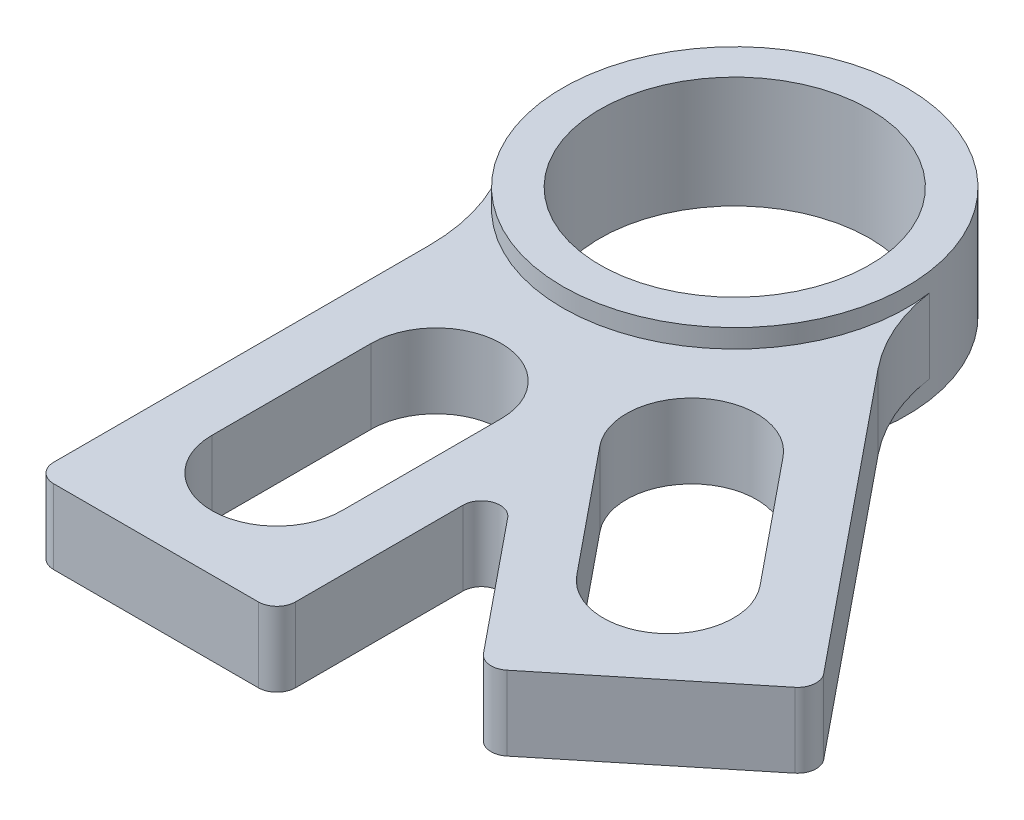
ISO-10303-21;
HEADER;
FILE_DESCRIPTION(('STEP AP214'),'2;1');
FILE_NAME('part.step','',(''),(''),'','','');
FILE_SCHEMA(('AUTOMOTIVE_DESIGN { 1 0 10303 214 1 1 1 1 }'));
ENDSEC;
DATA;
#1=APPLICATION_CONTEXT('core data for automotive mechanical design processes');
#2=APPLICATION_PROTOCOL_DEFINITION('international standard','automotive_design',2000,#1);
#3=PRODUCT_CONTEXT('',#1,'mechanical');
#4=PRODUCT('Part','Part','',(#3));
#5=PRODUCT_RELATED_PRODUCT_CATEGORY('part','',(#4));
#6=PRODUCT_DEFINITION_FORMATION('','',#4);
#7=PRODUCT_DEFINITION_CONTEXT('part definition',#1,'design');
#8=PRODUCT_DEFINITION('design','',#6,#7);
#9=PRODUCT_DEFINITION_SHAPE('','',#8);
#10=(LENGTH_UNIT() NAMED_UNIT(*) SI_UNIT(.MILLI.,.METRE.));
#11=(NAMED_UNIT(*) PLANE_ANGLE_UNIT() SI_UNIT($,.RADIAN.));
#12=(NAMED_UNIT(*) SI_UNIT($,.STERADIAN.) SOLID_ANGLE_UNIT());
#13=UNCERTAINTY_MEASURE_WITH_UNIT(LENGTH_MEASURE(1.E-05),#10,'distance_accuracy_value','');
#14=(GEOMETRIC_REPRESENTATION_CONTEXT(3) GLOBAL_UNCERTAINTY_ASSIGNED_CONTEXT((#13)) GLOBAL_UNIT_ASSIGNED_CONTEXT((#10,
#11,#12)) REPRESENTATION_CONTEXT('',''));
#15=CARTESIAN_POINT('',(0.,0.,0.));
#16=DIRECTION('',(0.,0.,1.));
#17=DIRECTION('',(1.,0.,0.));
#18=AXIS2_PLACEMENT_3D('',#15,#16,#17);
#19=CARTESIAN_POINT('',(0.,4.7625,0.));
#20=DIRECTION('',(0.,-1.,0.));
#21=DIRECTION('',(0.,0.,-1.));
#22=AXIS2_PLACEMENT_3D('',#19,#20,#21);
#23=CYLINDRICAL_SURFACE('',#22,11.5062);
#24=CARTESIAN_POINT('',(0.,4.7625,0.));
#25=DIRECTION('',(0.,1.,0.));
#26=DIRECTION('',(0.,0.,1.));
#27=AXIS2_PLACEMENT_3D('',#24,#25,#26);
#28=CIRCLE('',#27,11.5062);
#29=CARTESIAN_POINT('',(0.,4.7625,-11.5062));
#30=VERTEX_POINT('',#29);
#31=EDGE_CURVE('E301',#30,#30,#28,.T.);
#32=CARTESIAN_POINT('',(0.,-4.7625,0.));
#33=DIRECTION('',(0.,1.,0.));
#34=DIRECTION('',(0.,0.,1.));
#35=AXIS2_PLACEMENT_3D('',#32,#33,#34);
#36=CIRCLE('',#35,11.5062);
#37=CARTESIAN_POINT('',(0.,-4.7625,-11.5062));
#38=VERTEX_POINT('',#37);
#39=EDGE_CURVE('E296',#38,#38,#36,.T.);
#40=CARTESIAN_POINT('',(0.,4.7625,-11.5062));
#41=CARTESIAN_POINT('',(0.,4.66328125,-11.5062));
#42=CARTESIAN_POINT('',(0.,4.5640625,-11.5062));
#43=CARTESIAN_POINT('',(0.,4.365625,-11.5062));
#44=CARTESIAN_POINT('',(0.,4.26640625,-11.5062));
#45=CARTESIAN_POINT('',(0.,4.06796875,-11.5062));
#46=CARTESIAN_POINT('',(0.,3.96875,-11.5062));
#47=CARTESIAN_POINT('',(0.,3.7703125,-11.5062));
#48=CARTESIAN_POINT('',(0.,3.67109375,-11.5062));
#49=CARTESIAN_POINT('',(0.,3.47265625,-11.5062));
#50=CARTESIAN_POINT('',(0.,3.3734375,-11.5062));
#51=CARTESIAN_POINT('',(0.,3.175,-11.5062));
#52=CARTESIAN_POINT('',(0.,3.07578125,-11.5062));
#53=CARTESIAN_POINT('',(0.,2.87734375,-11.5062));
#54=CARTESIAN_POINT('',(0.,2.778125,-11.5062));
#55=CARTESIAN_POINT('',(0.,2.5796875,-11.5062));
#56=CARTESIAN_POINT('',(0.,2.48046875,-11.5062));
#57=CARTESIAN_POINT('',(0.,2.28203125,-11.5062));
#58=CARTESIAN_POINT('',(0.,2.1828125,-11.5062));
#59=CARTESIAN_POINT('',(0.,1.984375,-11.5062));
#60=CARTESIAN_POINT('',(0.,1.88515625,-11.5062));
#61=CARTESIAN_POINT('',(0.,1.68671875,-11.5062));
#62=CARTESIAN_POINT('',(0.,1.5875,-11.5062));
#63=CARTESIAN_POINT('',(0.,1.3890625,-11.5062));
#64=CARTESIAN_POINT('',(0.,1.28984375,-11.5062));
#65=CARTESIAN_POINT('',(0.,1.09140625,-11.5062));
#66=CARTESIAN_POINT('',(0.,0.992187499999999,-11.5062));
#67=CARTESIAN_POINT('',(0.,0.79375,-11.5062));
#68=CARTESIAN_POINT('',(0.,0.69453125,-11.5062));
#69=CARTESIAN_POINT('',(0.,0.49609375,-11.5062));
#70=CARTESIAN_POINT('',(0.,0.396875,-11.5062));
#71=CARTESIAN_POINT('',(0.,0.1984375,-11.5062));
#72=CARTESIAN_POINT('',(0.,0.0992187500000001,-11.5062));
#73=CARTESIAN_POINT('',(0.,-0.0992187500000001,-11.5062));
#74=CARTESIAN_POINT('',(0.,-0.1984375,-11.5062));
#75=CARTESIAN_POINT('',(0.,-0.396875,-11.5062));
#76=CARTESIAN_POINT('',(0.,-0.49609375,-11.5062));
#77=CARTESIAN_POINT('',(0.,-0.69453125,-11.5062));
#78=CARTESIAN_POINT('',(0.,-0.793750000000001,-11.5062));
#79=CARTESIAN_POINT('',(0.,-0.992187500000001,-11.5062));
#80=CARTESIAN_POINT('',(0.,-1.09140625,-11.5062));
#81=CARTESIAN_POINT('',(0.,-1.28984375,-11.5062));
#82=CARTESIAN_POINT('',(0.,-1.3890625,-11.5062));
#83=CARTESIAN_POINT('',(0.,-1.5875,-11.5062));
#84=CARTESIAN_POINT('',(0.,-1.68671875,-11.5062));
#85=CARTESIAN_POINT('',(0.,-1.88515625,-11.5062));
#86=CARTESIAN_POINT('',(0.,-1.984375,-11.5062));
#87=CARTESIAN_POINT('',(0.,-2.1828125,-11.5062));
#88=CARTESIAN_POINT('',(0.,-2.28203125,-11.5062));
#89=CARTESIAN_POINT('',(0.,-2.48046875,-11.5062));
#90=CARTESIAN_POINT('',(0.,-2.5796875,-11.5062));
#91=CARTESIAN_POINT('',(0.,-2.778125,-11.5062));
#92=CARTESIAN_POINT('',(0.,-2.87734375,-11.5062));
#93=CARTESIAN_POINT('',(0.,-3.07578125,-11.5062));
#94=CARTESIAN_POINT('',(0.,-3.175,-11.5062));
#95=CARTESIAN_POINT('',(0.,-3.3734375,-11.5062));
#96=CARTESIAN_POINT('',(0.,-3.47265625,-11.5062));
#97=CARTESIAN_POINT('',(0.,-3.67109375,-11.5062));
#98=CARTESIAN_POINT('',(0.,-3.7703125,-11.5062));
#99=CARTESIAN_POINT('',(0.,-3.96875,-11.5062));
#100=CARTESIAN_POINT('',(0.,-4.06796875,-11.5062));
#101=CARTESIAN_POINT('',(0.,-4.26640625,-11.5062));
#102=CARTESIAN_POINT('',(0.,-4.365625,-11.5062));
#103=CARTESIAN_POINT('',(0.,-4.5640625,-11.5062));
#104=CARTESIAN_POINT('',(0.,-4.66328125,-11.5062));
#105=CARTESIAN_POINT('',(0.,-4.7625,-11.5062));
#106=B_SPLINE_CURVE_WITH_KNOTS('',3,(#40,#41,#42,#43,#44,#45,#46,#47,#48,#49,#50,#51,#52,#53,
#54,#55,#56,#57,#58,#59,#60,#61,#62,#63,#64,#65,#66,#67,#68,#69,#70,#71,#72,#73,#74,#75,#76,#77,
#78,#79,#80,#81,#82,#83,#84,#85,#86,#87,#88,#89,#90,#91,#92,#93,#94,#95,#96,#97,#98,#99,#100,
#101,#102,#103,#104,#105),.UNSPECIFIED.,.F.,.F.,(4,2,2,2,2,2,2,2,2,2,2,2,2,2,2,2,2,2,2,2,2,2,2,
2,2,2,2,2,2,2,2,2,4),(0.,0.29765625,0.5953125,0.892968750000001,1.190625,1.48828125,1.7859375,
2.08359375,2.38125,2.67890625,2.9765625,3.27421875,3.571875,3.86953125,4.1671875,4.46484375,
4.7625,5.06015625,5.3578125,5.65546875,5.953125,6.25078125,6.5484375,6.84609375,7.14375,
7.44140625,7.7390625,8.03671875,8.334375,8.63203125,8.9296875,9.22734375,9.525),.UNSPECIFIED.);
#107=EDGE_CURVE('BSEAM43',#30,#38,#106,.T.);
#108=ORIENTED_EDGE('',*,*,#31,.T.);
#109=ORIENTED_EDGE('',*,*,#39,.F.);
#110=ORIENTED_EDGE('',*,*,#107,.T.);
#111=ORIENTED_EDGE('',*,*,#107,.F.);
#112=EDGE_LOOP('',(#108,#110,#109,#111));
#113=FACE_BOUND('',#112,.T.);
#114=ADVANCED_FACE('F43',(#113),#23,.F.);
#115=CARTESIAN_POINT('',(0.,4.7625,0.));
#116=DIRECTION('',(0.,-1.,0.));
#117=DIRECTION('',(0.,0.,-1.));
#118=AXIS2_PLACEMENT_3D('',#115,#116,#117);
#119=CYLINDRICAL_SURFACE('',#118,14.6812);
#120=DIRECTION('',(0.,-1.,0.));
#121=VECTOR('',#120,1.);
#122=CARTESIAN_POINT('',(14.5314286076469,4.7625,-2.09170171412202));
#123=LINE('',#122,#121);
#124=CARTESIAN_POINT('',(14.5314286076469,3.175,-2.09170171412202));
#125=VERTEX_POINT('',#124);
#126=CARTESIAN_POINT('',(14.5314286076469,-3.175,-2.09170171412202));
#127=VERTEX_POINT('',#126);
#128=EDGE_CURVE('E315',#125,#127,#123,.T.);
#129=ORIENTED_EDGE('',*,*,#128,.T.);
#130=CARTESIAN_POINT('',(0.,-3.175,0.));
#131=DIRECTION('',(0.,1.,0.));
#132=DIRECTION('',(0.,0.,1.));
#133=AXIS2_PLACEMENT_3D('',#130,#131,#132);
#134=CIRCLE('',#133,14.6812);
#135=CARTESIAN_POINT('',(-12.5938687913907,-3.175,7.54533646070437));
#136=VERTEX_POINT('',#135);
#137=EDGE_CURVE('E272',#136,#127,#134,.T.);
#138=ORIENTED_EDGE('',*,*,#137,.F.);
#139=DIRECTION('',(0.,-1.,0.));
#140=VECTOR('',#139,1.);
#141=CARTESIAN_POINT('',(-12.5938687913907,4.7625,7.54533646070436));
#142=LINE('',#141,#140);
#143=CARTESIAN_POINT('',(-12.5938687913907,3.175,7.54533646070437));
#144=VERTEX_POINT('',#143);
#145=EDGE_CURVE('E308',#136,#144,#142,.F.);
#146=ORIENTED_EDGE('',*,*,#145,.T.);
#147=CARTESIAN_POINT('',(0.,3.175,0.));
#148=DIRECTION('',(0.,1.,0.));
#149=DIRECTION('',(0.,0.,1.));
#150=AXIS2_PLACEMENT_3D('',#147,#148,#149);
#151=CIRCLE('',#150,14.6812);
#152=EDGE_CURVE('E234',#144,#125,#151,.T.);
#153=ORIENTED_EDGE('',*,*,#152,.T.);
#154=EDGE_LOOP('',(#129,#138,#146,#153));
#155=FACE_BOUND('',#154,.T.);
#156=CARTESIAN_POINT('',(0.,4.7625,0.));
#157=DIRECTION('',(0.,1.,0.));
#158=DIRECTION('',(0.,0.,1.));
#159=AXIS2_PLACEMENT_3D('',#156,#157,#158);
#160=CIRCLE('',#159,14.6812);
#161=CARTESIAN_POINT('',(0.,4.7625,14.6812));
#162=VERTEX_POINT('',#161);
#163=EDGE_CURVE('E304',#162,#162,#160,.T.);
#164=ORIENTED_EDGE('',*,*,#163,.F.);
#165=EDGE_LOOP('',(#164));
#166=FACE_BOUND('',#165,.T.);
#167=CARTESIAN_POINT('',(0.,-4.7625,0.));
#168=DIRECTION('',(0.,1.,0.));
#169=DIRECTION('',(0.,0.,1.));
#170=AXIS2_PLACEMENT_3D('',#167,#168,#169);
#171=CIRCLE('',#170,14.6812);
#172=CARTESIAN_POINT('',(0.,-4.7625,14.6812));
#173=VERTEX_POINT('',#172);
#174=EDGE_CURVE('E305',#173,#173,#171,.T.);
#175=ORIENTED_EDGE('',*,*,#174,.T.);
#176=EDGE_LOOP('',(#175));
#177=FACE_BOUND('',#176,.T.);
#178=ADVANCED_FACE('F411',(#155,#166,#177),#119,.T.);
#179=CARTESIAN_POINT('',(0.,4.7625,0.));
#180=DIRECTION('',(0.,1.,0.));
#181=DIRECTION('',(0.,0.,1.));
#182=AXIS2_PLACEMENT_3D('',#179,#180,#181);
#183=PLANE('',#182);
#184=ORIENTED_EDGE('',*,*,#31,.F.);
#185=EDGE_LOOP('',(#184));
#186=FACE_BOUND('',#185,.T.);
#187=ORIENTED_EDGE('',*,*,#163,.T.);
#188=EDGE_LOOP('',(#187));
#189=FACE_BOUND('',#188,.T.);
#190=ADVANCED_FACE('F447',(#186,#189),#183,.T.);
#191=CARTESIAN_POINT('',(0.,-4.7625,0.));
#192=DIRECTION('',(0.,1.,0.));
#193=DIRECTION('',(0.,0.,1.));
#194=AXIS2_PLACEMENT_3D('',#191,#192,#193);
#195=PLANE('',#194);
#196=ORIENTED_EDGE('',*,*,#39,.T.);
#197=EDGE_LOOP('',(#196));
#198=FACE_BOUND('',#197,.T.);
#199=ORIENTED_EDGE('',*,*,#174,.F.);
#200=EDGE_LOOP('',(#199));
#201=FACE_BOUND('',#200,.T.);
#202=ADVANCED_FACE('F621',(#198,#201),#195,.F.);
#203=CARTESIAN_POINT('',(-10.31875,3.175,0.));
#204=DIRECTION('',(-1.,0.,0.));
#205=DIRECTION('',(0.,0.,1.));
#206=AXIS2_PLACEMENT_3D('',#203,#204,#205);
#207=PLANE('',#206);
#208=DIRECTION('',(0.,0.,-1.));
#209=VECTOR('',#208,1.);
#210=CARTESIAN_POINT('',(-10.31875,-3.175,0.));
#211=LINE('',#210,#209);
#212=CARTESIAN_POINT('',(-10.31875,-3.175,47.8028));
#213=VERTEX_POINT('',#212);
#214=CARTESIAN_POINT('',(-10.31875,-3.175,15.7694921185655));
#215=VERTEX_POINT('',#214);
#216=EDGE_CURVE('E274',#213,#215,#211,.T.);
#217=ORIENTED_EDGE('',*,*,#216,.F.);
#218=DIRECTION('',(0.,-1.,0.));
#219=VECTOR('',#218,1.);
#220=CARTESIAN_POINT('',(-10.31875,3.175,47.8028));
#221=LINE('',#220,#219);
#222=CARTESIAN_POINT('',(-10.31875,3.175,47.8028));
#223=VERTEX_POINT('',#222);
#224=EDGE_CURVE('E374',#213,#223,#221,.F.);
#225=ORIENTED_EDGE('',*,*,#224,.T.);
#226=DIRECTION('',(0.,0.,-1.));
#227=VECTOR('',#226,1.);
#228=CARTESIAN_POINT('',(-10.31875,3.175,0.));
#229=LINE('',#228,#227);
#230=CARTESIAN_POINT('',(-10.31875,3.175,15.7694921185655));
#231=VERTEX_POINT('',#230);
#232=EDGE_CURVE('E236',#223,#231,#229,.T.);
#233=ORIENTED_EDGE('',*,*,#232,.T.);
#234=DIRECTION('',(0.,-1.,0.));
#235=VECTOR('',#234,1.);
#236=CARTESIAN_POINT('',(-10.31875,3.175,15.7694921185655));
#237=LINE('',#236,#235);
#238=EDGE_CURVE('E321',#231,#215,#237,.T.);
#239=ORIENTED_EDGE('',*,*,#238,.T.);
#240=EDGE_LOOP('',(#217,#225,#233,#239));
#241=FACE_BOUND('',#240,.T.);
#242=ADVANCED_FACE('F613',(#241),#207,.T.);
#243=CARTESIAN_POINT('',(0.,3.175,49.3903));
#244=DIRECTION('',(0.,0.,-1.));
#245=DIRECTION('',(-1.,0.,0.));
#246=AXIS2_PLACEMENT_3D('',#243,#244,#245);
#247=PLANE('',#246);
#248=DIRECTION('',(1.,0.,0.));
#249=VECTOR('',#248,1.);
#250=CARTESIAN_POINT('',(0.,-3.175,49.3903));
#251=LINE('',#250,#249);
#252=CARTESIAN_POINT('',(-8.73124999999999,-3.175,49.3903));
#253=VERTEX_POINT('',#252);
#254=CARTESIAN_POINT('',(8.73125,-3.175,49.3903));
#255=VERTEX_POINT('',#254);
#256=EDGE_CURVE('E276',#253,#255,#251,.T.);
#257=ORIENTED_EDGE('',*,*,#256,.T.);
#258=DIRECTION('',(0.,-1.,0.));
#259=VECTOR('',#258,1.);
#260=CARTESIAN_POINT('',(8.73125,3.175,49.3903));
#261=LINE('',#260,#259);
#262=CARTESIAN_POINT('',(8.73125,3.175,49.3903));
#263=VERTEX_POINT('',#262);
#264=EDGE_CURVE('E372',#255,#263,#261,.F.);
#265=ORIENTED_EDGE('',*,*,#264,.T.);
#266=DIRECTION('',(1.,0.,0.));
#267=VECTOR('',#266,1.);
#268=CARTESIAN_POINT('',(0.,3.175,49.3903));
#269=LINE('',#268,#267);
#270=CARTESIAN_POINT('',(-8.73124999999999,3.175,49.3903));
#271=VERTEX_POINT('',#270);
#272=EDGE_CURVE('E238',#271,#263,#269,.T.);
#273=ORIENTED_EDGE('',*,*,#272,.F.);
#274=DIRECTION('',(0.,-1.,0.));
#275=VECTOR('',#274,1.);
#276=CARTESIAN_POINT('',(-8.73124999999999,-3.175,49.3903));
#277=LINE('',#276,#275);
#278=EDGE_CURVE('E369',#271,#253,#277,.T.);
#279=ORIENTED_EDGE('',*,*,#278,.T.);
#280=EDGE_LOOP('',(#257,#265,#273,#279));
#281=FACE_BOUND('',#280,.T.);
#282=ADVANCED_FACE('F428',(#281),#247,.F.);
#283=CARTESIAN_POINT('',(10.31875,3.175,0.));
#284=DIRECTION('',(-1.,0.,0.));
#285=DIRECTION('',(0.,0.,1.));
#286=AXIS2_PLACEMENT_3D('',#283,#284,#285);
#287=PLANE('',#286);
#288=DIRECTION('',(0.,0.,-1.));
#289=VECTOR('',#288,1.);
#290=CARTESIAN_POINT('',(10.31875,-3.175,0.));
#291=LINE('',#290,#289);
#292=CARTESIAN_POINT('',(10.31875,-3.175,47.8028));
#293=VERTEX_POINT('',#292);
#294=CARTESIAN_POINT('',(10.31875,-3.175,33.5124305101251));
#295=VERTEX_POINT('',#294);
#296=EDGE_CURVE('E279',#293,#295,#291,.T.);
#297=ORIENTED_EDGE('',*,*,#296,.T.);
#298=DIRECTION('',(0.,-1.,0.));
#299=VECTOR('',#298,1.);
#300=CARTESIAN_POINT('',(10.31875,3.175,33.5124305101251));
#301=LINE('',#300,#299);
#302=CARTESIAN_POINT('',(10.31875,3.175,33.5124305101251));
#303=VERTEX_POINT('',#302);
#304=EDGE_CURVE('E367',#295,#303,#301,.F.);
#305=ORIENTED_EDGE('',*,*,#304,.T.);
#306=DIRECTION('',(0.,0.,-1.));
#307=VECTOR('',#306,1.);
#308=CARTESIAN_POINT('',(10.31875,3.175,0.));
#309=LINE('',#308,#307);
#310=CARTESIAN_POINT('',(10.31875,3.175,47.8028));
#311=VERTEX_POINT('',#310);
#312=EDGE_CURVE('E241',#311,#303,#309,.T.);
#313=ORIENTED_EDGE('',*,*,#312,.F.);
#314=DIRECTION('',(0.,-1.,0.));
#315=VECTOR('',#314,1.);
#316=CARTESIAN_POINT('',(10.31875,3.175,47.8028));
#317=LINE('',#316,#315);
#318=EDGE_CURVE('E364',#311,#293,#317,.T.);
#319=ORIENTED_EDGE('',*,*,#318,.T.);
#320=EDGE_LOOP('',(#297,#305,#313,#319));
#321=FACE_BOUND('',#320,.T.);
#322=ADVANCED_FACE('F383',(#321),#287,.F.);
#323=CARTESIAN_POINT('',(-8.00577533582321,3.175,6.510312038207));
#324=DIRECTION('',(-0.775847397778149,0.,0.630920609396201));
#325=DIRECTION('',(0.630920609396201,0.,0.775847397778149));
#326=AXIS2_PLACEMENT_3D('',#323,#324,#325);
#327=PLANE('',#326);
#328=DIRECTION('',(-0.630920609396201,0.,-0.775847397778149));
#329=VECTOR('',#328,1.);
#330=CARTESIAN_POINT('',(-8.00577533582321,-3.175,6.510312038207));
#331=LINE('',#330,#329);
#332=CARTESIAN_POINT('',(22.1539963710215,-3.175,43.5979900247163));
#333=VERTEX_POINT('',#332);
#334=CARTESIAN_POINT('',(13.1379077439728,-3.175,32.5108440427087));
#335=VERTEX_POINT('',#334);
#336=EDGE_CURVE('E282',#333,#335,#331,.T.);
#337=ORIENTED_EDGE('',*,*,#336,.F.);
#338=DIRECTION('',(0.,-1.,0.));
#339=VECTOR('',#338,1.);
#340=CARTESIAN_POINT('',(22.1539963710215,3.175,43.5979900247163));
#341=LINE('',#340,#339);
#342=CARTESIAN_POINT('',(22.1539963710215,3.175,43.5979900247163));
#343=VERTEX_POINT('',#342);
#344=EDGE_CURVE('E63',#333,#343,#341,.F.);
#345=ORIENTED_EDGE('',*,*,#344,.T.);
#346=DIRECTION('',(-0.630920609396201,0.,-0.775847397778149));
#347=VECTOR('',#346,1.);
#348=CARTESIAN_POINT('',(-8.00577533582321,3.175,6.510312038207));
#349=LINE('',#348,#347);
#350=CARTESIAN_POINT('',(13.1379077439728,3.175,32.5108440427087));
#351=VERTEX_POINT('',#350);
#352=EDGE_CURVE('E243',#343,#351,#349,.T.);
#353=ORIENTED_EDGE('',*,*,#352,.T.);
#354=DIRECTION('',(0.,-1.,0.));
#355=VECTOR('',#354,1.);
#356=CARTESIAN_POINT('',(13.1379077439728,3.175,32.5108440427087));
#357=LINE('',#356,#355);
#358=EDGE_CURVE('E360',#351,#335,#357,.T.);
#359=ORIENTED_EDGE('',*,*,#358,.T.);
#360=EDGE_LOOP('',(#337,#345,#353,#359));
#361=FACE_BOUND('',#360,.T.);
#362=ADVANCED_FACE('F387',(#361),#327,.T.);
#363=CARTESIAN_POINT('',(31.1613581742612,3.175,38.3193357304821));
#364=DIRECTION('',(-0.630920609396202,0.,-0.775847397778149));
#365=DIRECTION('',(-0.775847397778149,0.,0.630920609396202));
#366=AXIS2_PLACEMENT_3D('',#363,#364,#365);
#367=PLANE('',#366);
#368=DIRECTION('',(0.775847397778149,0.,-0.630920609396202));
#369=VECTOR('',#368,1.);
#370=CARTESIAN_POINT('',(31.1613581742612,-3.175,38.3193357304821));
#371=LINE('',#370,#369);
#372=CARTESIAN_POINT('',(24.3872405824108,-3.175,43.8280613012726));
#373=VERTEX_POINT('',#372);
#374=CARTESIAN_POINT('',(37.9354757661117,-3.175,32.8106101596915));
#375=VERTEX_POINT('',#374);
#376=EDGE_CURVE('E285',#373,#375,#371,.T.);
#377=ORIENTED_EDGE('',*,*,#376,.T.);
#378=DIRECTION('',(0.,-1.,0.));
#379=VECTOR('',#378,1.);
#380=CARTESIAN_POINT('',(37.9354757661117,3.175,32.8106101596915));
#381=LINE('',#380,#379);
#382=CARTESIAN_POINT('',(37.9354757661117,3.175,32.8106101596915));
#383=VERTEX_POINT('',#382);
#384=EDGE_CURVE('E350',#375,#383,#381,.F.);
#385=ORIENTED_EDGE('',*,*,#384,.T.);
#386=DIRECTION('',(0.775847397778149,0.,-0.630920609396202));
#387=VECTOR('',#386,1.);
#388=CARTESIAN_POINT('',(31.1613581742612,3.175,38.3193357304821));
#389=LINE('',#388,#387);
#390=CARTESIAN_POINT('',(24.3872405824108,3.175,43.8280613012726));
#391=VERTEX_POINT('',#390);
#392=EDGE_CURVE('E245',#391,#383,#389,.T.);
#393=ORIENTED_EDGE('',*,*,#392,.F.);
#394=DIRECTION('',(0.,-1.,0.));
#395=VECTOR('',#394,1.);
#396=CARTESIAN_POINT('',(24.3872405824108,-3.175,43.8280613012726));
#397=LINE('',#396,#395);
#398=EDGE_CURVE('E347',#391,#373,#397,.T.);
#399=ORIENTED_EDGE('',*,*,#398,.T.);
#400=EDGE_LOOP('',(#377,#385,#393,#399));
#401=FACE_BOUND('',#400,.T.);
#402=ADVANCED_FACE('F395',(#401),#367,.F.);
#403=CARTESIAN_POINT('',(0.,3.175,25.48255));
#404=DIRECTION('',(0.,-1.,0.));
#405=DIRECTION('',(0.,0.,-1.));
#406=AXIS2_PLACEMENT_3D('',#403,#404,#405);
#407=CYLINDRICAL_SURFACE('',#406,5.55625);
#408=CARTESIAN_POINT('',(0.,-3.175,25.48255));
#409=DIRECTION('',(0.,1.,0.));
#410=DIRECTION('',(0.,0.,1.));
#411=AXIS2_PLACEMENT_3D('',#408,#409,#410);
#412=CIRCLE('',#411,5.55625);
#413=CARTESIAN_POINT('',(5.55625,-3.175,25.48255));
#414=VERTEX_POINT('',#413);
#415=CARTESIAN_POINT('',(-5.55624999999999,-3.175,25.48255));
#416=VERTEX_POINT('',#415);
#417=EDGE_CURVE('E260',#414,#416,#412,.T.);
#418=ORIENTED_EDGE('',*,*,#417,.F.);
#419=DIRECTION('',(0.,-1.,0.));
#420=VECTOR('',#419,1.);
#421=CARTESIAN_POINT('',(5.55625,3.175,25.48255));
#422=LINE('',#421,#420);
#423=CARTESIAN_POINT('',(5.55625,3.175,25.48255));
#424=VERTEX_POINT('',#423);
#425=EDGE_CURVE('E294',#424,#414,#422,.T.);
#426=ORIENTED_EDGE('',*,*,#425,.F.);
#427=CARTESIAN_POINT('',(0.,3.175,25.48255));
#428=DIRECTION('',(0.,1.,0.));
#429=DIRECTION('',(0.,0.,1.));
#430=AXIS2_PLACEMENT_3D('',#427,#428,#429);
#431=CIRCLE('',#430,5.55625);
#432=CARTESIAN_POINT('',(-5.55624999999999,3.175,25.48255));
#433=VERTEX_POINT('',#432);
#434=EDGE_CURVE('E223',#424,#433,#431,.T.);
#435=ORIENTED_EDGE('',*,*,#434,.T.);
#436=DIRECTION('',(0.,-1.,0.));
#437=VECTOR('',#436,1.);
#438=CARTESIAN_POINT('',(-5.55624999999999,3.175,25.48255));
#439=LINE('',#438,#437);
#440=EDGE_CURVE('E202',#433,#416,#439,.T.);
#441=ORIENTED_EDGE('',*,*,#440,.T.);
#442=EDGE_LOOP('',(#418,#426,#435,#441));
#443=FACE_BOUND('',#442,.T.);
#444=ADVANCED_FACE('F575',(#443),#407,.F.);
#445=CARTESIAN_POINT('',(5.55625,3.175,0.));
#446=DIRECTION('',(-1.,0.,0.));
#447=DIRECTION('',(0.,0.,1.));
#448=AXIS2_PLACEMENT_3D('',#445,#446,#447);
#449=PLANE('',#448);
#450=DIRECTION('',(0.,0.,-1.));
#451=VECTOR('',#450,1.);
#452=CARTESIAN_POINT('',(5.55625,-3.175,0.));
#453=LINE('',#452,#451);
#454=CARTESIAN_POINT('',(5.55625,-3.175,39.07155));
#455=VERTEX_POINT('',#454);
#456=EDGE_CURVE('E263',#455,#414,#453,.T.);
#457=ORIENTED_EDGE('',*,*,#456,.F.);
#458=DIRECTION('',(0.,-1.,0.));
#459=VECTOR('',#458,1.);
#460=CARTESIAN_POINT('',(5.55625,3.175,39.07155));
#461=LINE('',#460,#459);
#462=CARTESIAN_POINT('',(5.55625,3.175,39.07155));
#463=VERTEX_POINT('',#462);
#464=EDGE_CURVE('E292',#463,#455,#461,.T.);
#465=ORIENTED_EDGE('',*,*,#464,.F.);
#466=DIRECTION('',(0.,0.,-1.));
#467=VECTOR('',#466,1.);
#468=CARTESIAN_POINT('',(5.55625,3.175,0.));
#469=LINE('',#468,#467);
#470=EDGE_CURVE('E226',#463,#424,#469,.T.);
#471=ORIENTED_EDGE('',*,*,#470,.T.);
#472=ORIENTED_EDGE('',*,*,#425,.T.);
#473=EDGE_LOOP('',(#457,#465,#471,#472));
#474=FACE_BOUND('',#473,.T.);
#475=ADVANCED_FACE('F566',(#474),#449,.T.);
#476=CARTESIAN_POINT('',(0.,3.175,39.07155));
#477=DIRECTION('',(0.,-1.,0.));
#478=DIRECTION('',(0.,0.,-1.));
#479=AXIS2_PLACEMENT_3D('',#476,#477,#478);
#480=CYLINDRICAL_SURFACE('',#479,5.55625);
#481=CARTESIAN_POINT('',(0.,-3.175,39.07155));
#482=DIRECTION('',(0.,1.,0.));
#483=DIRECTION('',(0.,0.,1.));
#484=AXIS2_PLACEMENT_3D('',#481,#482,#483);
#485=CIRCLE('',#484,5.55625);
#486=CARTESIAN_POINT('',(-5.55625,-3.175,39.07155));
#487=VERTEX_POINT('',#486);
#488=EDGE_CURVE('E266',#487,#455,#485,.T.);
#489=ORIENTED_EDGE('',*,*,#488,.F.);
#490=DIRECTION('',(0.,-1.,0.));
#491=VECTOR('',#490,1.);
#492=CARTESIAN_POINT('',(-5.55625,3.175,39.07155));
#493=LINE('',#492,#491);
#494=CARTESIAN_POINT('',(-5.55625,3.175,39.07155));
#495=VERTEX_POINT('',#494);
#496=EDGE_CURVE('E290',#495,#487,#493,.T.);
#497=ORIENTED_EDGE('',*,*,#496,.F.);
#498=CARTESIAN_POINT('',(0.,3.175,39.07155));
#499=DIRECTION('',(0.,1.,0.));
#500=DIRECTION('',(0.,0.,1.));
#501=AXIS2_PLACEMENT_3D('',#498,#499,#500);
#502=CIRCLE('',#501,5.55625);
#503=EDGE_CURVE('E229',#495,#463,#502,.T.);
#504=ORIENTED_EDGE('',*,*,#503,.T.);
#505=ORIENTED_EDGE('',*,*,#464,.T.);
#506=EDGE_LOOP('',(#489,#497,#504,#505));
#507=FACE_BOUND('',#506,.T.);
#508=ADVANCED_FACE('F558',(#507),#480,.F.);
#509=CARTESIAN_POINT('',(16.0774659749693,3.175,19.7705701062515));
#510=DIRECTION('',(0.,-1.,0.));
#511=DIRECTION('',(0.,0.,-1.));
#512=AXIS2_PLACEMENT_3D('',#509,#510,#511);
#513=CYLINDRICAL_SURFACE('',#512,5.55625000000001);
#514=CARTESIAN_POINT('',(16.0774659749693,-3.175,19.7705701062515));
#515=DIRECTION('',(0.,1.,0.));
#516=DIRECTION('',(0.,0.,1.));
#517=AXIS2_PLACEMENT_3D('',#514,#515,#516);
#518=CIRCLE('',#517,5.55625000000001);
#519=CARTESIAN_POINT('',(20.3882680788741,-3.175,16.2650174702939));
#520=VERTEX_POINT('',#519);
#521=CARTESIAN_POINT('',(11.7666638710644,-3.175,23.2761227422092));
#522=VERTEX_POINT('',#521);
#523=EDGE_CURVE('E197',#520,#522,#518,.T.);
#524=ORIENTED_EDGE('',*,*,#523,.F.);
#525=DIRECTION('',(0.,-1.,0.));
#526=VECTOR('',#525,1.);
#527=CARTESIAN_POINT('',(20.3882680788741,3.175,16.2650174702939));
#528=LINE('',#527,#526);
#529=CARTESIAN_POINT('',(20.3882680788741,3.175,16.2650174702939));
#530=VERTEX_POINT('',#529);
#531=EDGE_CURVE('E192',#530,#520,#528,.T.);
#532=ORIENTED_EDGE('',*,*,#531,.F.);
#533=CARTESIAN_POINT('',(16.0774659749693,3.175,19.7705701062515));
#534=DIRECTION('',(0.,1.,0.));
#535=DIRECTION('',(0.,0.,1.));
#536=AXIS2_PLACEMENT_3D('',#533,#534,#535);
#537=CIRCLE('',#536,5.55625000000001);
#538=CARTESIAN_POINT('',(11.7666638710644,3.175,23.2761227422092));
#539=VERTEX_POINT('',#538);
#540=EDGE_CURVE('E195',#530,#539,#537,.T.);
#541=ORIENTED_EDGE('',*,*,#540,.T.);
#542=DIRECTION('',(0.,-1.,0.));
#543=VECTOR('',#542,1.);
#544=CARTESIAN_POINT('',(11.7666638710644,3.175,23.2761227422092));
#545=LINE('',#544,#543);
#546=EDGE_CURVE('E250',#539,#522,#545,.T.);
#547=ORIENTED_EDGE('',*,*,#546,.T.);
#548=EDGE_LOOP('',(#524,#532,#541,#547));
#549=FACE_BOUND('',#548,.T.);
#550=ADVANCED_FACE('F194',(#549),#513,.F.);
#551=CARTESIAN_POINT('',(4.31080210390495,3.175,-3.50555263595772));
#552=DIRECTION('',(-0.77584739777815,0.,0.630920609396201));
#553=DIRECTION('',(0.630920609396201,0.,0.77584739777815));
#554=AXIS2_PLACEMENT_3D('',#551,#552,#553);
#555=PLANE('',#554);
#556=DIRECTION('',(-0.630920609396201,0.,-0.77584739777815));
#557=VECTOR('',#556,1.);
#558=CARTESIAN_POINT('',(4.31080210390495,-3.175,-3.50555263595772));
#559=LINE('',#558,#557);
#560=CARTESIAN_POINT('',(28.9618482399591,-3.175,26.8080077587011));
#561=VERTEX_POINT('',#560);
#562=EDGE_CURVE('E252',#561,#520,#559,.T.);
#563=ORIENTED_EDGE('',*,*,#562,.F.);
#564=DIRECTION('',(0.,-1.,0.));
#565=VECTOR('',#564,1.);
#566=CARTESIAN_POINT('',(28.9618482399591,3.175,26.8080077587011));
#567=LINE('',#566,#565);
#568=CARTESIAN_POINT('',(28.9618482399591,3.175,26.8080077587011));
#569=VERTEX_POINT('',#568);
#570=EDGE_CURVE('E203',#569,#561,#567,.T.);
#571=ORIENTED_EDGE('',*,*,#570,.F.);
#572=DIRECTION('',(-0.630920609396201,0.,-0.77584739777815));
#573=VECTOR('',#572,1.);
#574=CARTESIAN_POINT('',(4.31080210390495,3.175,-3.50555263595772));
#575=LINE('',#574,#573);
#576=EDGE_CURVE('E210',#569,#530,#575,.T.);
#577=ORIENTED_EDGE('',*,*,#576,.T.);
#578=ORIENTED_EDGE('',*,*,#531,.T.);
#579=EDGE_LOOP('',(#563,#571,#577,#578));
#580=FACE_BOUND('',#579,.T.);
#581=ADVANCED_FACE('F217',(#580),#555,.T.);
#582=CARTESIAN_POINT('',(24.6510461360542,3.175,30.3135603946588));
#583=DIRECTION('',(0.,-1.,0.));
#584=DIRECTION('',(0.,0.,-1.));
#585=AXIS2_PLACEMENT_3D('',#582,#583,#584);
#586=CYLINDRICAL_SURFACE('',#585,5.55625);
#587=CARTESIAN_POINT('',(24.6510461360542,-3.175,30.3135603946588));
#588=DIRECTION('',(0.,1.,0.));
#589=DIRECTION('',(0.,0.,1.));
#590=AXIS2_PLACEMENT_3D('',#587,#588,#589);
#591=CIRCLE('',#590,5.55625);
#592=CARTESIAN_POINT('',(20.3402440321494,-3.175,33.8191130306164));
#593=VERTEX_POINT('',#592);
#594=EDGE_CURVE('E254',#593,#561,#591,.T.);
#595=ORIENTED_EDGE('',*,*,#594,.F.);
#596=DIRECTION('',(0.,-1.,0.));
#597=VECTOR('',#596,1.);
#598=CARTESIAN_POINT('',(20.3402440321494,3.175,33.8191130306164));
#599=LINE('',#598,#597);
#600=CARTESIAN_POINT('',(20.3402440321494,3.175,33.8191130306164));
#601=VERTEX_POINT('',#600);
#602=EDGE_CURVE('E298',#601,#593,#599,.T.);
#603=ORIENTED_EDGE('',*,*,#602,.F.);
#604=CARTESIAN_POINT('',(24.6510461360542,3.175,30.3135603946588));
#605=DIRECTION('',(0.,1.,0.));
#606=DIRECTION('',(0.,0.,1.));
#607=AXIS2_PLACEMENT_3D('',#604,#605,#606);
#608=CIRCLE('',#607,5.55625);
#609=EDGE_CURVE('E218',#601,#569,#608,.T.);
#610=ORIENTED_EDGE('',*,*,#609,.T.);
#611=ORIENTED_EDGE('',*,*,#570,.T.);
#612=EDGE_LOOP('',(#595,#603,#610,#611));
#613=FACE_BOUND('',#612,.T.);
#614=ADVANCED_FACE('F534',(#613),#586,.F.);
#615=CARTESIAN_POINT('',(-5.55624999999999,3.175,0.));
#616=DIRECTION('',(-1.,0.,0.));
#617=DIRECTION('',(0.,0.,1.));
#618=AXIS2_PLACEMENT_3D('',#615,#616,#617);
#619=PLANE('',#618);
#620=DIRECTION('',(0.,0.,-1.));
#621=VECTOR('',#620,1.);
#622=CARTESIAN_POINT('',(-5.55624999999999,-3.175,0.));
#623=LINE('',#622,#621);
#624=EDGE_CURVE('E269',#487,#416,#623,.T.);
#625=ORIENTED_EDGE('',*,*,#624,.T.);
#626=ORIENTED_EDGE('',*,*,#440,.F.);
#627=DIRECTION('',(0.,0.,-1.));
#628=VECTOR('',#627,1.);
#629=CARTESIAN_POINT('',(-5.55624999999999,3.175,0.));
#630=LINE('',#629,#628);
#631=EDGE_CURVE('E232',#495,#433,#630,.T.);
#632=ORIENTED_EDGE('',*,*,#631,.F.);
#633=ORIENTED_EDGE('',*,*,#496,.T.);
#634=EDGE_LOOP('',(#625,#626,#632,#633));
#635=FACE_BOUND('',#634,.T.);
#636=ADVANCED_FACE('F525',(#635),#619,.F.);
#637=CARTESIAN_POINT('',(-4.31080210390479,3.175,3.50555263595761));
#638=DIRECTION('',(-0.775847397778149,0.,0.630920609396202));
#639=DIRECTION('',(0.630920609396202,0.,0.775847397778149));
#640=AXIS2_PLACEMENT_3D('',#637,#638,#639);
#641=PLANE('',#640);
#642=DIRECTION('',(-0.630920609396202,0.,-0.775847397778149));
#643=VECTOR('',#642,1.);
#644=CARTESIAN_POINT('',(-4.31080210390479,-3.175,3.50555263595761));
#645=LINE('',#644,#643);
#646=EDGE_CURVE('E257',#593,#522,#645,.T.);
#647=ORIENTED_EDGE('',*,*,#646,.T.);
#648=ORIENTED_EDGE('',*,*,#546,.F.);
#649=DIRECTION('',(-0.630920609396202,0.,-0.775847397778149));
#650=VECTOR('',#649,1.);
#651=CARTESIAN_POINT('',(-4.31080210390479,3.175,3.50555263595761));
#652=LINE('',#651,#650);
#653=EDGE_CURVE('E213',#601,#539,#652,.T.);
#654=ORIENTED_EDGE('',*,*,#653,.F.);
#655=ORIENTED_EDGE('',*,*,#602,.T.);
#656=EDGE_LOOP('',(#647,#648,#654,#655));
#657=FACE_BOUND('',#656,.T.);
#658=ADVANCED_FACE('F517',(#657),#641,.F.);
#659=CARTESIAN_POINT('',(8.00577533582332,3.175,-6.51031203820709));
#660=DIRECTION('',(-0.775847397778149,0.,0.630920609396202));
#661=DIRECTION('',(0.630920609396202,0.,0.775847397778149));
#662=AXIS2_PLACEMENT_3D('',#659,#660,#661);
#663=PLANE('',#662);
#664=DIRECTION('',(-0.630920609396202,0.,-0.775847397778149));
#665=VECTOR('',#664,1.);
#666=CARTESIAN_POINT('',(8.00577533582332,3.175,-6.51031203820709));
#667=LINE('',#666,#665);
#668=CARTESIAN_POINT('',(38.1655470426681,3.175,30.5773659483022));
#669=VERTEX_POINT('',#668);
#670=CARTESIAN_POINT('',(17.9550729131372,3.175,5.72440738626493));
#671=VERTEX_POINT('',#670);
#672=EDGE_CURVE('E248',#669,#671,#667,.T.);
#673=ORIENTED_EDGE('',*,*,#672,.F.);
#674=DIRECTION('',(0.,-1.,0.));
#675=VECTOR('',#674,1.);
#676=CARTESIAN_POINT('',(38.1655470426681,3.175,30.5773659483022));
#677=LINE('',#676,#675);
#678=CARTESIAN_POINT('',(38.1655470426681,-3.175,30.5773659483022));
#679=VERTEX_POINT('',#678);
#680=EDGE_CURVE('E336',#669,#679,#677,.T.);
#681=ORIENTED_EDGE('',*,*,#680,.T.);
#682=DIRECTION('',(-0.630920609396202,0.,-0.775847397778149));
#683=VECTOR('',#682,1.);
#684=CARTESIAN_POINT('',(8.00577533582332,-3.175,-6.51031203820709));
#685=LINE('',#684,#683);
#686=CARTESIAN_POINT('',(17.9550729131372,-3.175,5.72440738626493));
#687=VERTEX_POINT('',#686);
#688=EDGE_CURVE('E215',#679,#687,#685,.T.);
#689=ORIENTED_EDGE('',*,*,#688,.T.);
#690=DIRECTION('',(0.,1.,0.));
#691=VECTOR('',#690,1.);
#692=CARTESIAN_POINT('',(17.9550729131372,3.175,5.72440738626493));
#693=LINE('',#692,#691);
#694=EDGE_CURVE('E318',#687,#671,#693,.T.);
#695=ORIENTED_EDGE('',*,*,#694,.T.);
#696=EDGE_LOOP('',(#673,#681,#689,#695));
#697=FACE_BOUND('',#696,.T.);
#698=ADVANCED_FACE('F403',(#697),#663,.F.);
#699=CARTESIAN_POINT('',(0.,3.175,0.));
#700=DIRECTION('',(0.,1.,0.));
#701=DIRECTION('',(0.,0.,1.));
#702=AXIS2_PLACEMENT_3D('',#699,#700,#701);
#703=PLANE('',#702);
#704=ORIENTED_EDGE('',*,*,#540,.F.);
#705=ORIENTED_EDGE('',*,*,#576,.F.);
#706=ORIENTED_EDGE('',*,*,#609,.F.);
#707=ORIENTED_EDGE('',*,*,#653,.T.);
#708=EDGE_LOOP('',(#704,#705,#706,#707));
#709=FACE_BOUND('',#708,.T.);
#710=ORIENTED_EDGE('',*,*,#434,.F.);
#711=ORIENTED_EDGE('',*,*,#470,.F.);
#712=ORIENTED_EDGE('',*,*,#503,.F.);
#713=ORIENTED_EDGE('',*,*,#631,.T.);
#714=EDGE_LOOP('',(#710,#711,#712,#713));
#715=FACE_BOUND('',#714,.T.);
#716=ORIENTED_EDGE('',*,*,#392,.T.);
#717=CARTESIAN_POINT('',(36.9338892986953,3.175,31.5789524157187));
#718=DIRECTION('',(0.,1.,0.));
#719=DIRECTION('',(0.,0.,1.));
#720=AXIS2_PLACEMENT_3D('',#717,#718,#719);
#721=CIRCLE('',#720,1.5875);
#722=EDGE_CURVE('E358',#383,#669,#721,.T.);
#723=ORIENTED_EDGE('',*,*,#722,.T.);
#724=ORIENTED_EDGE('',*,*,#672,.T.);
#725=CARTESIAN_POINT('',(30.3701829723832,3.175,-4.37158420529308));
#726=DIRECTION('',(0.,1.,0.));
#727=DIRECTION('',(0.,0.,1.));
#728=AXIS2_PLACEMENT_3D('',#725,#726,#727);
#729=CIRCLE('',#728,16.002);
#730=EDGE_CURVE('E327',#671,#125,#729,.F.);
#731=ORIENTED_EDGE('',*,*,#730,.T.);
#732=ORIENTED_EDGE('',*,*,#152,.F.);
#733=CARTESIAN_POINT('',(-26.32075,3.175,15.7694921185655));
#734=DIRECTION('',(0.,1.,0.));
#735=DIRECTION('',(0.,0.,1.));
#736=AXIS2_PLACEMENT_3D('',#733,#734,#735);
#737=CIRCLE('',#736,16.002);
#738=EDGE_CURVE('E333',#144,#231,#737,.F.);
#739=ORIENTED_EDGE('',*,*,#738,.T.);
#740=ORIENTED_EDGE('',*,*,#232,.F.);
#741=CARTESIAN_POINT('',(-8.73124999999999,3.175,47.8028));
#742=DIRECTION('',(0.,1.,0.));
#743=DIRECTION('',(0.,0.,1.));
#744=AXIS2_PLACEMENT_3D('',#741,#742,#743);
#745=CIRCLE('',#744,1.5875);
#746=EDGE_CURVE('E352',#223,#271,#745,.T.);
#747=ORIENTED_EDGE('',*,*,#746,.T.);
#748=ORIENTED_EDGE('',*,*,#272,.T.);
#749=CARTESIAN_POINT('',(8.73125,3.175,47.8028));
#750=DIRECTION('',(0.,1.,0.));
#751=DIRECTION('',(0.,0.,1.));
#752=AXIS2_PLACEMENT_3D('',#749,#750,#751);
#753=CIRCLE('',#752,1.5875);
#754=EDGE_CURVE('E354',#263,#311,#753,.T.);
#755=ORIENTED_EDGE('',*,*,#754,.T.);
#756=ORIENTED_EDGE('',*,*,#312,.T.);
#757=CARTESIAN_POINT('',(11.90625,3.175,33.5124305101251));
#758=DIRECTION('',(0.,1.,0.));
#759=DIRECTION('',(0.,0.,1.));
#760=AXIS2_PLACEMENT_3D('',#757,#758,#759);
#761=CIRCLE('',#760,1.5875);
#762=EDGE_CURVE('E11',#303,#351,#761,.F.);
#763=ORIENTED_EDGE('',*,*,#762,.T.);
#764=ORIENTED_EDGE('',*,*,#352,.F.);
#765=CARTESIAN_POINT('',(23.3856541149943,3.175,42.5964035572998));
#766=DIRECTION('',(0.,1.,0.));
#767=DIRECTION('',(0.,0.,1.));
#768=AXIS2_PLACEMENT_3D('',#765,#766,#767);
#769=CIRCLE('',#768,1.5875);
#770=EDGE_CURVE('E356',#343,#391,#769,.T.);
#771=ORIENTED_EDGE('',*,*,#770,.T.);
#772=EDGE_LOOP('',(#716,#723,#724,#731,#732,#739,#740,#747,#748,#755,#756,#763,#764,#771));
#773=FACE_BOUND('',#772,.T.);
#774=ADVANCED_FACE('F207',(#709,#715,#773),#703,.T.);
#775=CARTESIAN_POINT('',(0.,-3.175,0.));
#776=DIRECTION('',(0.,1.,0.));
#777=DIRECTION('',(0.,0.,1.));
#778=AXIS2_PLACEMENT_3D('',#775,#776,#777);
#779=PLANE('',#778);
#780=ORIENTED_EDGE('',*,*,#523,.T.);
#781=ORIENTED_EDGE('',*,*,#646,.F.);
#782=ORIENTED_EDGE('',*,*,#594,.T.);
#783=ORIENTED_EDGE('',*,*,#562,.T.);
#784=EDGE_LOOP('',(#780,#781,#782,#783));
#785=FACE_BOUND('',#784,.T.);
#786=ORIENTED_EDGE('',*,*,#417,.T.);
#787=ORIENTED_EDGE('',*,*,#624,.F.);
#788=ORIENTED_EDGE('',*,*,#488,.T.);
#789=ORIENTED_EDGE('',*,*,#456,.T.);
#790=EDGE_LOOP('',(#786,#787,#788,#789));
#791=FACE_BOUND('',#790,.T.);
#792=ORIENTED_EDGE('',*,*,#688,.F.);
#793=CARTESIAN_POINT('',(36.9338892986953,-3.175,31.5789524157187));
#794=DIRECTION('',(0.,1.,0.));
#795=DIRECTION('',(0.,0.,1.));
#796=AXIS2_PLACEMENT_3D('',#793,#794,#795);
#797=CIRCLE('',#796,1.5875);
#798=EDGE_CURVE('E345',#679,#375,#797,.F.);
#799=ORIENTED_EDGE('',*,*,#798,.T.);
#800=ORIENTED_EDGE('',*,*,#376,.F.);
#801=CARTESIAN_POINT('',(23.3856541149943,-3.175,42.5964035572998));
#802=DIRECTION('',(0.,1.,0.));
#803=DIRECTION('',(0.,0.,1.));
#804=AXIS2_PLACEMENT_3D('',#801,#802,#803);
#805=CIRCLE('',#804,1.5875);
#806=EDGE_CURVE('E343',#373,#333,#805,.F.);
#807=ORIENTED_EDGE('',*,*,#806,.T.);
#808=ORIENTED_EDGE('',*,*,#336,.T.);
#809=CARTESIAN_POINT('',(11.90625,-3.175,33.5124305101251));
#810=DIRECTION('',(0.,1.,0.));
#811=DIRECTION('',(0.,0.,1.));
#812=AXIS2_PLACEMENT_3D('',#809,#810,#811);
#813=CIRCLE('',#812,1.5875);
#814=EDGE_CURVE('E51',#335,#295,#813,.T.);
#815=ORIENTED_EDGE('',*,*,#814,.T.);
#816=ORIENTED_EDGE('',*,*,#296,.F.);
#817=CARTESIAN_POINT('',(8.73125,-3.175,47.8028));
#818=DIRECTION('',(0.,1.,0.));
#819=DIRECTION('',(0.,0.,1.));
#820=AXIS2_PLACEMENT_3D('',#817,#818,#819);
#821=CIRCLE('',#820,1.5875);
#822=EDGE_CURVE('E341',#293,#255,#821,.F.);
#823=ORIENTED_EDGE('',*,*,#822,.T.);
#824=ORIENTED_EDGE('',*,*,#256,.F.);
#825=CARTESIAN_POINT('',(-8.73124999999999,-3.175,47.8028));
#826=DIRECTION('',(0.,1.,0.));
#827=DIRECTION('',(0.,0.,1.));
#828=AXIS2_PLACEMENT_3D('',#825,#826,#827);
#829=CIRCLE('',#828,1.5875);
#830=EDGE_CURVE('E339',#253,#213,#829,.F.);
#831=ORIENTED_EDGE('',*,*,#830,.T.);
#832=ORIENTED_EDGE('',*,*,#216,.T.);
#833=CARTESIAN_POINT('',(-26.32075,-3.175,15.7694921185655));
#834=DIRECTION('',(0.,1.,0.));
#835=DIRECTION('',(0.,0.,1.));
#836=AXIS2_PLACEMENT_3D('',#833,#834,#835);
#837=CIRCLE('',#836,16.002);
#838=EDGE_CURVE('E330',#215,#136,#837,.T.);
#839=ORIENTED_EDGE('',*,*,#838,.T.);
#840=ORIENTED_EDGE('',*,*,#137,.T.);
#841=CARTESIAN_POINT('',(30.3701829723832,-3.175,-4.37158420529308));
#842=DIRECTION('',(0.,1.,0.));
#843=DIRECTION('',(0.,0.,1.));
#844=AXIS2_PLACEMENT_3D('',#841,#842,#843);
#845=CIRCLE('',#844,16.002);
#846=EDGE_CURVE('E324',#127,#687,#845,.T.);
#847=ORIENTED_EDGE('',*,*,#846,.T.);
#848=EDGE_LOOP('',(#792,#799,#800,#807,#808,#815,#816,#823,#824,#831,#832,#839,#840,#847));
#849=FACE_BOUND('',#848,.T.);
#850=ADVANCED_FACE('F378',(#785,#791,#849),#779,.F.);
#851=CARTESIAN_POINT('',(30.3701829723832,4.7625,-4.37158420529308));
#852=DIRECTION('',(0.,-1.,0.));
#853=DIRECTION('',(0.,0.,-1.));
#854=AXIS2_PLACEMENT_3D('',#851,#852,#853);
#855=CYLINDRICAL_SURFACE('',#854,16.002);
#856=ORIENTED_EDGE('',*,*,#730,.F.);
#857=ORIENTED_EDGE('',*,*,#694,.F.);
#858=ORIENTED_EDGE('',*,*,#846,.F.);
#859=ORIENTED_EDGE('',*,*,#128,.F.);
#860=EDGE_LOOP('',(#856,#857,#858,#859));
#861=FACE_BOUND('',#860,.T.);
#862=ADVANCED_FACE('F409',(#861),#855,.F.);
#863=CARTESIAN_POINT('',(-26.32075,4.7625,15.7694921185655));
#864=DIRECTION('',(0.,-1.,0.));
#865=DIRECTION('',(0.,0.,-1.));
#866=AXIS2_PLACEMENT_3D('',#863,#864,#865);
#867=CYLINDRICAL_SURFACE('',#866,16.002);
#868=ORIENTED_EDGE('',*,*,#738,.F.);
#869=ORIENTED_EDGE('',*,*,#145,.F.);
#870=ORIENTED_EDGE('',*,*,#838,.F.);
#871=ORIENTED_EDGE('',*,*,#238,.F.);
#872=EDGE_LOOP('',(#868,#869,#870,#871));
#873=FACE_BOUND('',#872,.T.);
#874=ADVANCED_FACE('F418',(#873),#867,.F.);
#875=CARTESIAN_POINT('',(36.9338892986953,3.175,31.5789524157187));
#876=DIRECTION('',(0.,-1.,0.));
#877=DIRECTION('',(0.,0.,-1.));
#878=AXIS2_PLACEMENT_3D('',#875,#876,#877);
#879=CYLINDRICAL_SURFACE('',#878,1.5875);
#880=ORIENTED_EDGE('',*,*,#722,.F.);
#881=ORIENTED_EDGE('',*,*,#384,.F.);
#882=ORIENTED_EDGE('',*,*,#798,.F.);
#883=ORIENTED_EDGE('',*,*,#680,.F.);
#884=EDGE_LOOP('',(#880,#881,#882,#883));
#885=FACE_BOUND('',#884,.T.);
#886=ADVANCED_FACE('F400',(#885),#879,.T.);
#887=CARTESIAN_POINT('',(23.3856541149943,3.175,42.5964035572998));
#888=DIRECTION('',(0.,1.,0.));
#889=DIRECTION('',(0.,0.,1.));
#890=AXIS2_PLACEMENT_3D('',#887,#888,#889);
#891=CYLINDRICAL_SURFACE('',#890,1.5875);
#892=ORIENTED_EDGE('',*,*,#770,.F.);
#893=ORIENTED_EDGE('',*,*,#344,.F.);
#894=ORIENTED_EDGE('',*,*,#806,.F.);
#895=ORIENTED_EDGE('',*,*,#398,.F.);
#896=EDGE_LOOP('',(#892,#893,#894,#895));
#897=FACE_BOUND('',#896,.T.);
#898=ADVANCED_FACE('F392',(#897),#891,.T.);
#899=CARTESIAN_POINT('',(11.90625,3.175,33.5124305101251));
#900=DIRECTION('',(0.,-1.,0.));
#901=DIRECTION('',(0.,0.,-1.));
#902=AXIS2_PLACEMENT_3D('',#899,#900,#901);
#903=CYLINDRICAL_SURFACE('',#902,1.5875);
#904=ORIENTED_EDGE('',*,*,#762,.F.);
#905=ORIENTED_EDGE('',*,*,#304,.F.);
#906=ORIENTED_EDGE('',*,*,#814,.F.);
#907=ORIENTED_EDGE('',*,*,#358,.F.);
#908=EDGE_LOOP('',(#904,#905,#906,#907));
#909=FACE_BOUND('',#908,.T.);
#910=ADVANCED_FACE('F386',(#909),#903,.F.);
#911=CARTESIAN_POINT('',(8.73125,3.175,47.8028));
#912=DIRECTION('',(0.,-1.,0.));
#913=DIRECTION('',(0.,0.,-1.));
#914=AXIS2_PLACEMENT_3D('',#911,#912,#913);
#915=CYLINDRICAL_SURFACE('',#914,1.5875);
#916=ORIENTED_EDGE('',*,*,#754,.F.);
#917=ORIENTED_EDGE('',*,*,#264,.F.);
#918=ORIENTED_EDGE('',*,*,#822,.F.);
#919=ORIENTED_EDGE('',*,*,#318,.F.);
#920=EDGE_LOOP('',(#916,#917,#918,#919));
#921=FACE_BOUND('',#920,.T.);
#922=ADVANCED_FACE('F433',(#921),#915,.T.);
#923=CARTESIAN_POINT('',(-8.73124999999999,3.175,47.8028));
#924=DIRECTION('',(0.,1.,0.));
#925=DIRECTION('',(0.,0.,1.));
#926=AXIS2_PLACEMENT_3D('',#923,#924,#925);
#927=CYLINDRICAL_SURFACE('',#926,1.5875);
#928=ORIENTED_EDGE('',*,*,#746,.F.);
#929=ORIENTED_EDGE('',*,*,#224,.F.);
#930=ORIENTED_EDGE('',*,*,#830,.F.);
#931=ORIENTED_EDGE('',*,*,#278,.F.);
#932=EDGE_LOOP('',(#928,#929,#930,#931));
#933=FACE_BOUND('',#932,.T.);
#934=ADVANCED_FACE('F45',(#933),#927,.T.);
#935=CLOSED_SHELL('',(#114,#178,#190,#202,#242,#282,#322,#362,#402,#444,#475,#508,#550,#581,
#614,#636,#658,#698,#774,#850,#862,#874,#886,#898,#910,#922,#934));
#936=MANIFOLD_SOLID_BREP('B2',#935);
#937=ADVANCED_BREP_SHAPE_REPRESENTATION('',(#18,#936),#14);
#938=SHAPE_DEFINITION_REPRESENTATION(#9,#937);
ENDSEC;
END-ISO-10303-21;
